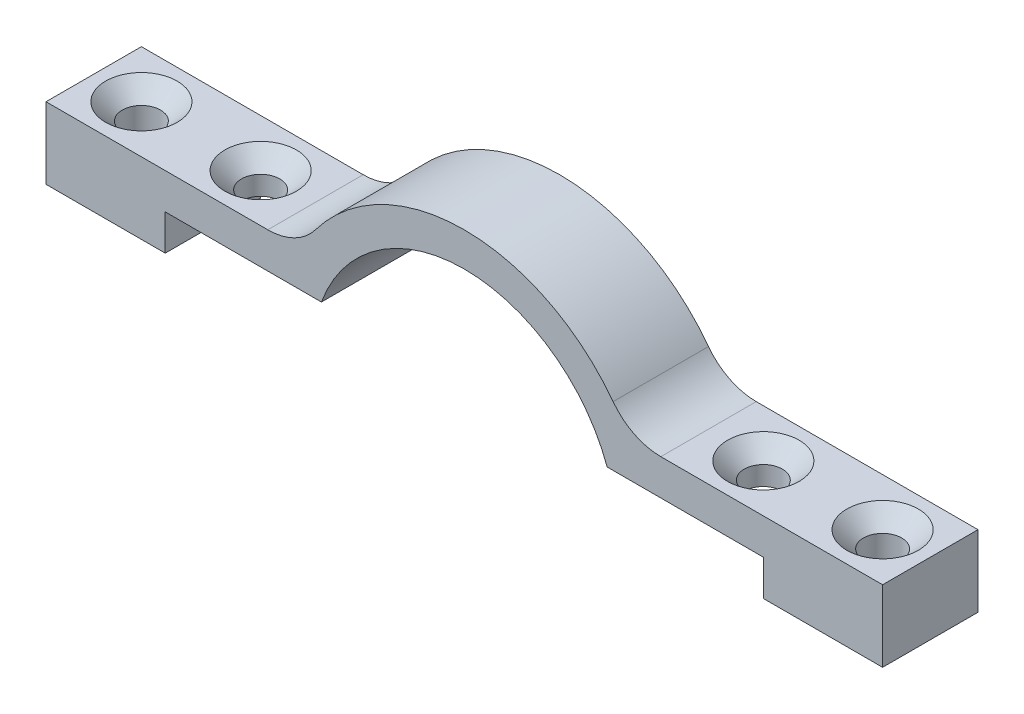
ISO-10303-21;
HEADER;
FILE_DESCRIPTION(('STEP AP214'),'2;1');
FILE_NAME('part.step','',(''),(''),'','','');
FILE_SCHEMA(('AUTOMOTIVE_DESIGN { 1 0 10303 214 1 1 1 1 }'));
ENDSEC;
DATA;
#1=APPLICATION_CONTEXT('core data for automotive mechanical design processes');
#2=APPLICATION_PROTOCOL_DEFINITION('international standard','automotive_design',2000,#1);
#3=PRODUCT_CONTEXT('',#1,'mechanical');
#4=PRODUCT('Part','Part','',(#3));
#5=PRODUCT_RELATED_PRODUCT_CATEGORY('part','',(#4));
#6=PRODUCT_DEFINITION_FORMATION('','',#4);
#7=PRODUCT_DEFINITION_CONTEXT('part definition',#1,'design');
#8=PRODUCT_DEFINITION('design','',#6,#7);
#9=PRODUCT_DEFINITION_SHAPE('','',#8);
#10=(LENGTH_UNIT() NAMED_UNIT(*) SI_UNIT(.MILLI.,.METRE.));
#11=(NAMED_UNIT(*) PLANE_ANGLE_UNIT() SI_UNIT($,.RADIAN.));
#12=(NAMED_UNIT(*) SI_UNIT($,.STERADIAN.) SOLID_ANGLE_UNIT());
#13=UNCERTAINTY_MEASURE_WITH_UNIT(LENGTH_MEASURE(1.E-05),#10,'distance_accuracy_value','');
#14=(GEOMETRIC_REPRESENTATION_CONTEXT(3) GLOBAL_UNCERTAINTY_ASSIGNED_CONTEXT((#13)) GLOBAL_UNIT_ASSIGNED_CONTEXT((#10,
#11,#12)) REPRESENTATION_CONTEXT('',''));
#15=CARTESIAN_POINT('',(0.,0.,0.));
#16=DIRECTION('',(0.,0.,1.));
#17=DIRECTION('',(1.,0.,0.));
#18=AXIS2_PLACEMENT_3D('',#15,#16,#17);
#19=CARTESIAN_POINT('',(0.,4.3607568274022,8.));
#20=DIRECTION('',(0.,1.,0.));
#21=DIRECTION('',(0.,0.,1.));
#22=AXIS2_PLACEMENT_3D('',#19,#20,#21);
#23=PLANE('',#22);
#24=CARTESIAN_POINT('',(21.0781106916815,4.3607568274022,4.));
#25=DIRECTION('',(0.,1.,0.));
#26=DIRECTION('',(0.,0.,1.));
#27=AXIS2_PLACEMENT_3D('',#24,#25,#26);
#28=CIRCLE('',#27,1.60000000000001);
#29=CARTESIAN_POINT('',(21.0781106916815,4.3607568274022,5.60000000000001));
#30=VERTEX_POINT('',#29);
#31=EDGE_CURVE('E275',#30,#30,#28,.T.);
#32=ORIENTED_EDGE('',*,*,#31,.T.);
#33=EDGE_LOOP('',(#32));
#34=FACE_BOUND('',#33,.T.);
#35=DIRECTION('',(1.,0.,0.));
#36=VECTOR('',#35,1.);
#37=CARTESIAN_POINT('',(0.,4.3607568274022,0.));
#38=LINE('',#37,#36);
#39=CARTESIAN_POINT('',(11.9810809150204,4.3607568274022,0.));
#40=VERTEX_POINT('',#39);
#41=CARTESIAN_POINT('',(25.0781106916815,4.3607568274022,0.));
#42=VERTEX_POINT('',#41);
#43=EDGE_CURVE('E157',#40,#42,#38,.T.);
#44=ORIENTED_EDGE('',*,*,#43,.T.);
#45=DIRECTION('',(0.,0.,-1.));
#46=VECTOR('',#45,1.);
#47=CARTESIAN_POINT('',(25.0781106916815,4.3607568274022,8.));
#48=LINE('',#47,#46);
#49=CARTESIAN_POINT('',(25.0781106916815,4.3607568274022,8.));
#50=VERTEX_POINT('',#49);
#51=EDGE_CURVE('E155',#50,#42,#48,.T.);
#52=ORIENTED_EDGE('',*,*,#51,.F.);
#53=DIRECTION('',(1.,0.,0.));
#54=VECTOR('',#53,1.);
#55=CARTESIAN_POINT('',(0.,4.3607568274022,8.));
#56=LINE('',#55,#54);
#57=CARTESIAN_POINT('',(11.9810809150204,4.3607568274022,8.));
#58=VERTEX_POINT('',#57);
#59=EDGE_CURVE('E143',#58,#50,#56,.T.);
#60=ORIENTED_EDGE('',*,*,#59,.F.);
#61=DIRECTION('',(0.,0.,-1.));
#62=VECTOR('',#61,1.);
#63=CARTESIAN_POINT('',(11.9810809150204,4.3607568274022,8.));
#64=LINE('',#63,#62);
#65=EDGE_CURVE('E204',#58,#40,#64,.T.);
#66=ORIENTED_EDGE('',*,*,#65,.T.);
#67=EDGE_LOOP('',(#44,#52,#60,#66));
#68=FACE_BOUND('',#67,.T.);
#69=ADVANCED_FACE('F41',(#34,#68),#23,.F.);
#70=CARTESIAN_POINT('',(25.0781106916815,0.,8.));
#71=DIRECTION('',(-1.,0.,0.));
#72=DIRECTION('',(0.,-1.,0.));
#73=AXIS2_PLACEMENT_3D('',#70,#71,#72);
#74=PLANE('',#73);
#75=DIRECTION('',(0.,1.,0.));
#76=VECTOR('',#75,1.);
#77=CARTESIAN_POINT('',(25.0781106916815,0.,0.));
#78=LINE('',#77,#76);
#79=CARTESIAN_POINT('',(25.0781106916815,1.3607568274022,0.));
#80=VERTEX_POINT('',#79);
#81=EDGE_CURVE('E207',#80,#42,#78,.T.);
#82=ORIENTED_EDGE('',*,*,#81,.F.);
#83=DIRECTION('',(0.,0.,-1.));
#84=VECTOR('',#83,1.);
#85=CARTESIAN_POINT('',(25.0781106916815,1.3607568274022,8.));
#86=LINE('',#85,#84);
#87=CARTESIAN_POINT('',(25.0781106916815,1.3607568274022,8.));
#88=VERTEX_POINT('',#87);
#89=EDGE_CURVE('E163',#88,#80,#86,.T.);
#90=ORIENTED_EDGE('',*,*,#89,.F.);
#91=DIRECTION('',(0.,1.,0.));
#92=VECTOR('',#91,1.);
#93=CARTESIAN_POINT('',(25.0781106916815,0.,8.));
#94=LINE('',#93,#92);
#95=EDGE_CURVE('E147',#88,#50,#94,.T.);
#96=ORIENTED_EDGE('',*,*,#95,.T.);
#97=ORIENTED_EDGE('',*,*,#51,.T.);
#98=EDGE_LOOP('',(#82,#90,#96,#97));
#99=FACE_BOUND('',#98,.T.);
#100=ADVANCED_FACE('F165',(#99),#74,.T.);
#101=CARTESIAN_POINT('',(0.,1.3607568274022,8.));
#102=DIRECTION('',(0.,1.,0.));
#103=DIRECTION('',(-1.,0.,0.));
#104=AXIS2_PLACEMENT_3D('',#101,#102,#103);
#105=PLANE('',#104);
#106=CARTESIAN_POINT('',(31.0781106916815,1.3607568274022,4.));
#107=DIRECTION('',(0.,1.,0.));
#108=DIRECTION('',(0.,0.,1.));
#109=AXIS2_PLACEMENT_3D('',#106,#107,#108);
#110=CIRCLE('',#109,1.6);
#111=CARTESIAN_POINT('',(31.0781106916815,1.3607568274022,5.6));
#112=VERTEX_POINT('',#111);
#113=EDGE_CURVE('E208',#112,#112,#110,.T.);
#114=ORIENTED_EDGE('',*,*,#113,.T.);
#115=EDGE_LOOP('',(#114));
#116=FACE_BOUND('',#115,.T.);
#117=DIRECTION('',(1.,0.,0.));
#118=VECTOR('',#117,1.);
#119=CARTESIAN_POINT('',(0.,1.3607568274022,0.));
#120=LINE('',#119,#118);
#121=CARTESIAN_POINT('',(35.0781106916815,1.3607568274022,0.));
#122=VERTEX_POINT('',#121);
#123=EDGE_CURVE('E211',#80,#122,#120,.T.);
#124=ORIENTED_EDGE('',*,*,#123,.T.);
#125=DIRECTION('',(0.,0.,-1.));
#126=VECTOR('',#125,1.);
#127=CARTESIAN_POINT('',(35.0781106916815,1.3607568274022,8.));
#128=LINE('',#127,#126);
#129=CARTESIAN_POINT('',(35.0781106916815,1.3607568274022,8.));
#130=VERTEX_POINT('',#129);
#131=EDGE_CURVE('E269',#130,#122,#128,.T.);
#132=ORIENTED_EDGE('',*,*,#131,.F.);
#133=DIRECTION('',(1.,0.,0.));
#134=VECTOR('',#133,1.);
#135=CARTESIAN_POINT('',(0.,1.3607568274022,8.));
#136=LINE('',#135,#134);
#137=EDGE_CURVE('E168',#88,#130,#136,.T.);
#138=ORIENTED_EDGE('',*,*,#137,.F.);
#139=ORIENTED_EDGE('',*,*,#89,.T.);
#140=EDGE_LOOP('',(#124,#132,#138,#139));
#141=FACE_BOUND('',#140,.T.);
#142=ADVANCED_FACE('F340',(#116,#141),#105,.F.);
#143=CARTESIAN_POINT('',(35.0781106916815,0.,8.));
#144=DIRECTION('',(-1.,0.,0.));
#145=DIRECTION('',(0.,0.,1.));
#146=AXIS2_PLACEMENT_3D('',#143,#144,#145);
#147=PLANE('',#146);
#148=DIRECTION('',(0.,1.,0.));
#149=VECTOR('',#148,1.);
#150=CARTESIAN_POINT('',(35.0781106916815,0.,0.));
#151=LINE('',#150,#149);
#152=CARTESIAN_POINT('',(35.0781106916815,7.36075682740221,0.));
#153=VERTEX_POINT('',#152);
#154=EDGE_CURVE('E214',#122,#153,#151,.T.);
#155=ORIENTED_EDGE('',*,*,#154,.T.);
#156=DIRECTION('',(0.,0.,-1.));
#157=VECTOR('',#156,1.);
#158=CARTESIAN_POINT('',(35.0781106916815,7.36075682740221,8.));
#159=LINE('',#158,#157);
#160=CARTESIAN_POINT('',(35.0781106916815,7.36075682740221,8.));
#161=VERTEX_POINT('',#160);
#162=EDGE_CURVE('E265',#161,#153,#159,.T.);
#163=ORIENTED_EDGE('',*,*,#162,.F.);
#164=DIRECTION('',(0.,1.,0.));
#165=VECTOR('',#164,1.);
#166=CARTESIAN_POINT('',(35.0781106916815,0.,8.));
#167=LINE('',#166,#165);
#168=EDGE_CURVE('E171',#130,#161,#167,.T.);
#169=ORIENTED_EDGE('',*,*,#168,.F.);
#170=ORIENTED_EDGE('',*,*,#131,.T.);
#171=EDGE_LOOP('',(#155,#163,#169,#170));
#172=FACE_BOUND('',#171,.T.);
#173=ADVANCED_FACE('F343',(#172),#147,.F.);
#174=CARTESIAN_POINT('',(0.,7.3607568274022,8.));
#175=DIRECTION('',(0.,-1.,0.));
#176=DIRECTION('',(1.,0.,0.));
#177=AXIS2_PLACEMENT_3D('',#174,#175,#176);
#178=PLANE('',#177);
#179=CARTESIAN_POINT('',(21.0781106916815,7.3607568274022,4.));
#180=DIRECTION('',(0.,1.,0.));
#181=DIRECTION('',(0.,0.,1.));
#182=AXIS2_PLACEMENT_3D('',#179,#180,#181);
#183=CIRCLE('',#182,3.);
#184=CARTESIAN_POINT('',(21.0781106916815,7.3607568274022,7.));
#185=VERTEX_POINT('',#184);
#186=EDGE_CURVE('E285',#185,#185,#183,.T.);
#187=ORIENTED_EDGE('',*,*,#186,.F.);
#188=EDGE_LOOP('',(#187));
#189=FACE_BOUND('',#188,.T.);
#190=CARTESIAN_POINT('',(31.0781106916815,7.3607568274022,4.));
#191=DIRECTION('',(0.,1.,0.));
#192=DIRECTION('',(0.,0.,1.));
#193=AXIS2_PLACEMENT_3D('',#190,#191,#192);
#194=CIRCLE('',#193,3.);
#195=CARTESIAN_POINT('',(31.0781106916815,7.3607568274022,7.));
#196=VERTEX_POINT('',#195);
#197=EDGE_CURVE('E452',#196,#196,#194,.T.);
#198=ORIENTED_EDGE('',*,*,#197,.F.);
#199=EDGE_LOOP('',(#198));
#200=FACE_BOUND('',#199,.T.);
#201=DIRECTION('',(-1.,0.,0.));
#202=VECTOR('',#201,1.);
#203=CARTESIAN_POINT('',(0.,7.3607568274022,0.));
#204=LINE('',#203,#202);
#205=CARTESIAN_POINT('',(16.4794323522939,7.3607568274022,0.));
#206=VERTEX_POINT('',#205);
#207=EDGE_CURVE('E217',#153,#206,#204,.T.);
#208=ORIENTED_EDGE('',*,*,#207,.T.);
#209=DIRECTION('',(0.,0.,1.));
#210=VECTOR('',#209,1.);
#211=CARTESIAN_POINT('',(16.4794323522939,7.3607568274022,8.));
#212=LINE('',#211,#210);
#213=CARTESIAN_POINT('',(16.4794323522939,7.3607568274022,8.));
#214=VERTEX_POINT('',#213);
#215=EDGE_CURVE('E293',#206,#214,#212,.T.);
#216=ORIENTED_EDGE('',*,*,#215,.T.);
#217=DIRECTION('',(-1.,0.,0.));
#218=VECTOR('',#217,1.);
#219=CARTESIAN_POINT('',(0.,7.3607568274022,8.));
#220=LINE('',#219,#218);
#221=EDGE_CURVE('E177',#161,#214,#220,.T.);
#222=ORIENTED_EDGE('',*,*,#221,.F.);
#223=ORIENTED_EDGE('',*,*,#162,.T.);
#224=EDGE_LOOP('',(#208,#216,#222,#223));
#225=FACE_BOUND('',#224,.T.);
#226=ADVANCED_FACE('F351',(#189,#200,#225),#178,.F.);
#227=CARTESIAN_POINT('',(0.,0.,8.));
#228=DIRECTION('',(0.,0.,-1.));
#229=DIRECTION('',(-1.,0.,0.));
#230=AXIS2_PLACEMENT_3D('',#227,#228,#229);
#231=CYLINDRICAL_SURFACE('',#230,15.6);
#232=CARTESIAN_POINT('',(0.,0.,8.));
#233=DIRECTION('',(0.,0.,1.));
#234=DIRECTION('',(1.,0.,0.));
#235=AXIS2_PLACEMENT_3D('',#232,#233,#234);
#236=CIRCLE('',#235,15.6);
#237=CARTESIAN_POINT('',(12.4795701308633,9.3605731314308,8.));
#238=VERTEX_POINT('',#237);
#239=CARTESIAN_POINT('',(-12.4795701308633,9.36057313143079,8.));
#240=VERTEX_POINT('',#239);
#241=EDGE_CURVE('E181',#238,#240,#236,.T.);
#242=ORIENTED_EDGE('',*,*,#241,.F.);
#243=DIRECTION('',(0.,0.,-1.));
#244=VECTOR('',#243,1.);
#245=CARTESIAN_POINT('',(12.4795701308633,9.3605731314308,8.));
#246=LINE('',#245,#244);
#247=CARTESIAN_POINT('',(12.4795701308633,9.3605731314308,0.));
#248=VERTEX_POINT('',#247);
#249=EDGE_CURVE('E289',#238,#248,#246,.T.);
#250=ORIENTED_EDGE('',*,*,#249,.T.);
#251=CARTESIAN_POINT('',(0.,0.,0.));
#252=DIRECTION('',(0.,0.,1.));
#253=DIRECTION('',(1.,0.,0.));
#254=AXIS2_PLACEMENT_3D('',#251,#252,#253);
#255=CIRCLE('',#254,15.6);
#256=CARTESIAN_POINT('',(-12.4795701308633,9.36057313143079,0.));
#257=VERTEX_POINT('',#256);
#258=EDGE_CURVE('E221',#248,#257,#255,.T.);
#259=ORIENTED_EDGE('',*,*,#258,.T.);
#260=DIRECTION('',(0.,0.,-1.));
#261=VECTOR('',#260,1.);
#262=CARTESIAN_POINT('',(-12.4795701308633,9.36057313143079,8.));
#263=LINE('',#262,#261);
#264=EDGE_CURVE('E162',#257,#240,#263,.F.);
#265=ORIENTED_EDGE('',*,*,#264,.T.);
#266=EDGE_LOOP('',(#242,#250,#259,#265));
#267=FACE_BOUND('',#266,.T.);
#268=ADVANCED_FACE('F311',(#267),#231,.T.);
#269=CARTESIAN_POINT('',(0.,7.3607568274022,8.));
#270=DIRECTION('',(0.,1.,0.));
#271=DIRECTION('',(-1.,0.,0.));
#272=AXIS2_PLACEMENT_3D('',#269,#270,#271);
#273=PLANE('',#272);
#274=CARTESIAN_POINT('',(-21.0781106916815,7.3607568274022,4.));
#275=DIRECTION('',(0.,1.,0.));
#276=DIRECTION('',(0.,0.,1.));
#277=AXIS2_PLACEMENT_3D('',#274,#275,#276);
#278=CIRCLE('',#277,3.);
#279=CARTESIAN_POINT('',(-21.0781106916815,7.3607568274022,7.));
#280=VERTEX_POINT('',#279);
#281=EDGE_CURVE('E435',#280,#280,#278,.T.);
#282=ORIENTED_EDGE('',*,*,#281,.F.);
#283=EDGE_LOOP('',(#282));
#284=FACE_BOUND('',#283,.T.);
#285=CARTESIAN_POINT('',(-31.0781106916815,7.3607568274022,4.));
#286=DIRECTION('',(0.,1.,0.));
#287=DIRECTION('',(0.,0.,1.));
#288=AXIS2_PLACEMENT_3D('',#285,#286,#287);
#289=CIRCLE('',#288,3.);
#290=CARTESIAN_POINT('',(-31.0781106916815,7.3607568274022,7.));
#291=VERTEX_POINT('',#290);
#292=EDGE_CURVE('E279',#291,#291,#289,.T.);
#293=ORIENTED_EDGE('',*,*,#292,.F.);
#294=EDGE_LOOP('',(#293));
#295=FACE_BOUND('',#294,.T.);
#296=DIRECTION('',(1.,0.,0.));
#297=VECTOR('',#296,1.);
#298=CARTESIAN_POINT('',(0.,7.3607568274022,8.));
#299=LINE('',#298,#297);
#300=CARTESIAN_POINT('',(-35.0781106916815,7.3607568274022,8.));
#301=VERTEX_POINT('',#300);
#302=CARTESIAN_POINT('',(-16.4794323522939,7.3607568274022,8.));
#303=VERTEX_POINT('',#302);
#304=EDGE_CURVE('E184',#301,#303,#299,.T.);
#305=ORIENTED_EDGE('',*,*,#304,.T.);
#306=DIRECTION('',(0.,0.,-1.));
#307=VECTOR('',#306,1.);
#308=CARTESIAN_POINT('',(-16.4794323522939,7.3607568274022,8.));
#309=LINE('',#308,#307);
#310=CARTESIAN_POINT('',(-16.4794323522939,7.3607568274022,0.));
#311=VERTEX_POINT('',#310);
#312=EDGE_CURVE('E296',#303,#311,#309,.T.);
#313=ORIENTED_EDGE('',*,*,#312,.T.);
#314=DIRECTION('',(1.,0.,0.));
#315=VECTOR('',#314,1.);
#316=CARTESIAN_POINT('',(0.,7.3607568274022,0.));
#317=LINE('',#316,#315);
#318=CARTESIAN_POINT('',(-35.0781106916815,7.3607568274022,0.));
#319=VERTEX_POINT('',#318);
#320=EDGE_CURVE('E225',#319,#311,#317,.T.);
#321=ORIENTED_EDGE('',*,*,#320,.F.);
#322=DIRECTION('',(0.,0.,-1.));
#323=VECTOR('',#322,1.);
#324=CARTESIAN_POINT('',(-35.0781106916815,7.3607568274022,8.));
#325=LINE('',#324,#323);
#326=EDGE_CURVE('E262',#301,#319,#325,.T.);
#327=ORIENTED_EDGE('',*,*,#326,.F.);
#328=EDGE_LOOP('',(#305,#313,#321,#327));
#329=FACE_BOUND('',#328,.T.);
#330=ADVANCED_FACE('F314',(#284,#295,#329),#273,.T.);
#331=CARTESIAN_POINT('',(-35.0781106916815,0.,8.));
#332=DIRECTION('',(-1.,0.,0.));
#333=DIRECTION('',(0.,0.,1.));
#334=AXIS2_PLACEMENT_3D('',#331,#332,#333);
#335=PLANE('',#334);
#336=DIRECTION('',(0.,1.,0.));
#337=VECTOR('',#336,1.);
#338=CARTESIAN_POINT('',(-35.0781106916815,0.,0.));
#339=LINE('',#338,#337);
#340=CARTESIAN_POINT('',(-35.0781106916815,1.3607568274022,0.));
#341=VERTEX_POINT('',#340);
#342=EDGE_CURVE('E229',#341,#319,#339,.T.);
#343=ORIENTED_EDGE('',*,*,#342,.F.);
#344=DIRECTION('',(0.,0.,-1.));
#345=VECTOR('',#344,1.);
#346=CARTESIAN_POINT('',(-35.0781106916815,1.3607568274022,8.));
#347=LINE('',#346,#345);
#348=CARTESIAN_POINT('',(-35.0781106916815,1.3607568274022,8.));
#349=VERTEX_POINT('',#348);
#350=EDGE_CURVE('E259',#349,#341,#347,.T.);
#351=ORIENTED_EDGE('',*,*,#350,.F.);
#352=DIRECTION('',(0.,1.,0.));
#353=VECTOR('',#352,1.);
#354=CARTESIAN_POINT('',(-35.0781106916815,0.,8.));
#355=LINE('',#354,#353);
#356=EDGE_CURVE('E187',#349,#301,#355,.T.);
#357=ORIENTED_EDGE('',*,*,#356,.T.);
#358=ORIENTED_EDGE('',*,*,#326,.T.);
#359=EDGE_LOOP('',(#343,#351,#357,#358));
#360=FACE_BOUND('',#359,.T.);
#361=ADVANCED_FACE('F319',(#360),#335,.T.);
#362=CARTESIAN_POINT('',(0.,1.3607568274022,8.));
#363=DIRECTION('',(0.,-1.,0.));
#364=DIRECTION('',(1.,0.,0.));
#365=AXIS2_PLACEMENT_3D('',#362,#363,#364);
#366=PLANE('',#365);
#367=CARTESIAN_POINT('',(-31.0781106916815,1.3607568274022,4.));
#368=DIRECTION('',(0.,1.,0.));
#369=DIRECTION('',(0.,0.,1.));
#370=AXIS2_PLACEMENT_3D('',#367,#368,#369);
#371=CIRCLE('',#370,1.6);
#372=CARTESIAN_POINT('',(-31.0781106916815,1.3607568274022,5.6));
#373=VERTEX_POINT('',#372);
#374=EDGE_CURVE('E444',#373,#373,#371,.T.);
#375=ORIENTED_EDGE('',*,*,#374,.T.);
#376=EDGE_LOOP('',(#375));
#377=FACE_BOUND('',#376,.T.);
#378=DIRECTION('',(-1.,0.,0.));
#379=VECTOR('',#378,1.);
#380=CARTESIAN_POINT('',(0.,1.3607568274022,0.));
#381=LINE('',#380,#379);
#382=CARTESIAN_POINT('',(-25.0781106916815,1.3607568274022,0.));
#383=VERTEX_POINT('',#382);
#384=EDGE_CURVE('E233',#383,#341,#381,.T.);
#385=ORIENTED_EDGE('',*,*,#384,.F.);
#386=DIRECTION('',(0.,0.,-1.));
#387=VECTOR('',#386,1.);
#388=CARTESIAN_POINT('',(-25.0781106916815,1.3607568274022,8.));
#389=LINE('',#388,#387);
#390=CARTESIAN_POINT('',(-25.0781106916815,1.3607568274022,8.));
#391=VERTEX_POINT('',#390);
#392=EDGE_CURVE('E256',#391,#383,#389,.T.);
#393=ORIENTED_EDGE('',*,*,#392,.F.);
#394=DIRECTION('',(-1.,0.,0.));
#395=VECTOR('',#394,1.);
#396=CARTESIAN_POINT('',(0.,1.3607568274022,8.));
#397=LINE('',#396,#395);
#398=EDGE_CURVE('E191',#391,#349,#397,.T.);
#399=ORIENTED_EDGE('',*,*,#398,.T.);
#400=ORIENTED_EDGE('',*,*,#350,.T.);
#401=EDGE_LOOP('',(#385,#393,#399,#400));
#402=FACE_BOUND('',#401,.T.);
#403=ADVANCED_FACE('F322',(#377,#402),#366,.T.);
#404=CARTESIAN_POINT('',(-25.0781106916815,0.,8.));
#405=DIRECTION('',(1.,0.,0.));
#406=DIRECTION('',(0.,0.,-1.));
#407=AXIS2_PLACEMENT_3D('',#404,#405,#406);
#408=PLANE('',#407);
#409=DIRECTION('',(0.,-1.,0.));
#410=VECTOR('',#409,1.);
#411=CARTESIAN_POINT('',(-25.0781106916815,0.,0.));
#412=LINE('',#411,#410);
#413=CARTESIAN_POINT('',(-25.0781106916815,4.3607568274022,0.));
#414=VERTEX_POINT('',#413);
#415=EDGE_CURVE('E237',#414,#383,#412,.T.);
#416=ORIENTED_EDGE('',*,*,#415,.F.);
#417=DIRECTION('',(0.,0.,-1.));
#418=VECTOR('',#417,1.);
#419=CARTESIAN_POINT('',(-25.0781106916815,4.3607568274022,8.));
#420=LINE('',#419,#418);
#421=CARTESIAN_POINT('',(-25.0781106916815,4.3607568274022,8.));
#422=VERTEX_POINT('',#421);
#423=EDGE_CURVE('E253',#422,#414,#420,.T.);
#424=ORIENTED_EDGE('',*,*,#423,.F.);
#425=DIRECTION('',(0.,-1.,0.));
#426=VECTOR('',#425,1.);
#427=CARTESIAN_POINT('',(-25.0781106916815,0.,8.));
#428=LINE('',#427,#426);
#429=EDGE_CURVE('E195',#422,#391,#428,.T.);
#430=ORIENTED_EDGE('',*,*,#429,.T.);
#431=ORIENTED_EDGE('',*,*,#392,.T.);
#432=EDGE_LOOP('',(#416,#424,#430,#431));
#433=FACE_BOUND('',#432,.T.);
#434=ADVANCED_FACE('F326',(#433),#408,.T.);
#435=CARTESIAN_POINT('',(0.,4.3607568274022,8.));
#436=DIRECTION('',(0.,1.,0.));
#437=DIRECTION('',(0.,0.,1.));
#438=AXIS2_PLACEMENT_3D('',#435,#436,#437);
#439=PLANE('',#438);
#440=CARTESIAN_POINT('',(-21.0781106916815,4.3607568274022,4.));
#441=DIRECTION('',(0.,1.,0.));
#442=DIRECTION('',(0.,0.,1.));
#443=AXIS2_PLACEMENT_3D('',#440,#441,#442);
#444=CIRCLE('',#443,1.60000000000001);
#445=CARTESIAN_POINT('',(-21.0781106916815,4.3607568274022,5.60000000000001));
#446=VERTEX_POINT('',#445);
#447=EDGE_CURVE('E281',#446,#446,#444,.T.);
#448=ORIENTED_EDGE('',*,*,#447,.T.);
#449=EDGE_LOOP('',(#448));
#450=FACE_BOUND('',#449,.T.);
#451=DIRECTION('',(1.,0.,0.));
#452=VECTOR('',#451,1.);
#453=CARTESIAN_POINT('',(0.,4.3607568274022,0.));
#454=LINE('',#453,#452);
#455=CARTESIAN_POINT('',(-11.9810809150204,4.3607568274022,0.));
#456=VERTEX_POINT('',#455);
#457=EDGE_CURVE('E241',#414,#456,#454,.T.);
#458=ORIENTED_EDGE('',*,*,#457,.T.);
#459=DIRECTION('',(0.,0.,-1.));
#460=VECTOR('',#459,1.);
#461=CARTESIAN_POINT('',(-11.9810809150204,4.3607568274022,8.));
#462=LINE('',#461,#460);
#463=CARTESIAN_POINT('',(-11.9810809150204,4.3607568274022,8.));
#464=VERTEX_POINT('',#463);
#465=EDGE_CURVE('E250',#464,#456,#462,.T.);
#466=ORIENTED_EDGE('',*,*,#465,.F.);
#467=DIRECTION('',(1.,0.,0.));
#468=VECTOR('',#467,1.);
#469=CARTESIAN_POINT('',(0.,4.3607568274022,8.));
#470=LINE('',#469,#468);
#471=EDGE_CURVE('E199',#422,#464,#470,.T.);
#472=ORIENTED_EDGE('',*,*,#471,.F.);
#473=ORIENTED_EDGE('',*,*,#423,.T.);
#474=EDGE_LOOP('',(#458,#466,#472,#473));
#475=FACE_BOUND('',#474,.T.);
#476=ADVANCED_FACE('F331',(#450,#475),#439,.F.);
#477=CARTESIAN_POINT('',(0.,0.,8.));
#478=DIRECTION('',(0.,0.,-1.));
#479=DIRECTION('',(-1.,0.,0.));
#480=AXIS2_PLACEMENT_3D('',#477,#478,#479);
#481=CYLINDRICAL_SURFACE('',#480,12.75);
#482=CARTESIAN_POINT('',(0.,0.,0.));
#483=DIRECTION('',(0.,0.,1.));
#484=DIRECTION('',(1.,0.,0.));
#485=AXIS2_PLACEMENT_3D('',#482,#483,#484);
#486=CIRCLE('',#485,12.75);
#487=EDGE_CURVE('E152',#40,#456,#486,.T.);
#488=ORIENTED_EDGE('',*,*,#487,.F.);
#489=ORIENTED_EDGE('',*,*,#65,.F.);
#490=CARTESIAN_POINT('',(0.,0.,8.));
#491=DIRECTION('',(0.,0.,1.));
#492=DIRECTION('',(1.,0.,0.));
#493=AXIS2_PLACEMENT_3D('',#490,#491,#492);
#494=CIRCLE('',#493,12.75);
#495=EDGE_CURVE('E149',#58,#464,#494,.T.);
#496=ORIENTED_EDGE('',*,*,#495,.T.);
#497=ORIENTED_EDGE('',*,*,#465,.T.);
#498=EDGE_LOOP('',(#488,#489,#496,#497));
#499=FACE_BOUND('',#498,.T.);
#500=ADVANCED_FACE('F334',(#499),#481,.F.);
#501=CARTESIAN_POINT('',(0.,0.,8.));
#502=DIRECTION('',(0.,0.,1.));
#503=DIRECTION('',(1.,0.,0.));
#504=AXIS2_PLACEMENT_3D('',#501,#502,#503);
#505=PLANE('',#504);
#506=ORIENTED_EDGE('',*,*,#59,.T.);
#507=ORIENTED_EDGE('',*,*,#95,.F.);
#508=ORIENTED_EDGE('',*,*,#137,.T.);
#509=ORIENTED_EDGE('',*,*,#168,.T.);
#510=ORIENTED_EDGE('',*,*,#221,.T.);
#511=CARTESIAN_POINT('',(16.4794323522939,12.3607568274022,8.));
#512=DIRECTION('',(0.,0.,1.));
#513=DIRECTION('',(1.,0.,0.));
#514=AXIS2_PLACEMENT_3D('',#511,#512,#513);
#515=CIRCLE('',#514,5.);
#516=EDGE_CURVE('E302',#214,#238,#515,.F.);
#517=ORIENTED_EDGE('',*,*,#516,.T.);
#518=ORIENTED_EDGE('',*,*,#241,.T.);
#519=CARTESIAN_POINT('',(-16.4794323522939,12.3607568274022,8.));
#520=DIRECTION('',(0.,0.,1.));
#521=DIRECTION('',(1.,0.,0.));
#522=AXIS2_PLACEMENT_3D('',#519,#520,#521);
#523=CIRCLE('',#522,5.);
#524=EDGE_CURVE('E11',#240,#303,#523,.F.);
#525=ORIENTED_EDGE('',*,*,#524,.T.);
#526=ORIENTED_EDGE('',*,*,#304,.F.);
#527=ORIENTED_EDGE('',*,*,#356,.F.);
#528=ORIENTED_EDGE('',*,*,#398,.F.);
#529=ORIENTED_EDGE('',*,*,#429,.F.);
#530=ORIENTED_EDGE('',*,*,#471,.T.);
#531=ORIENTED_EDGE('',*,*,#495,.F.);
#532=EDGE_LOOP('',(#506,#507,#508,#509,#510,#517,#518,#525,#526,#527,#528,#529,#530,#531));
#533=FACE_BOUND('',#532,.T.);
#534=ADVANCED_FACE('F145',(#533),#505,.T.);
#535=CARTESIAN_POINT('',(0.,0.,0.));
#536=DIRECTION('',(0.,0.,1.));
#537=DIRECTION('',(1.,0.,0.));
#538=AXIS2_PLACEMENT_3D('',#535,#536,#537);
#539=PLANE('',#538);
#540=ORIENTED_EDGE('',*,*,#43,.F.);
#541=ORIENTED_EDGE('',*,*,#487,.T.);
#542=ORIENTED_EDGE('',*,*,#457,.F.);
#543=ORIENTED_EDGE('',*,*,#415,.T.);
#544=ORIENTED_EDGE('',*,*,#384,.T.);
#545=ORIENTED_EDGE('',*,*,#342,.T.);
#546=ORIENTED_EDGE('',*,*,#320,.T.);
#547=CARTESIAN_POINT('',(-16.4794323522939,12.3607568274022,0.));
#548=DIRECTION('',(0.,0.,1.));
#549=DIRECTION('',(1.,0.,0.));
#550=AXIS2_PLACEMENT_3D('',#547,#548,#549);
#551=CIRCLE('',#550,5.);
#552=EDGE_CURVE('E50',#311,#257,#551,.T.);
#553=ORIENTED_EDGE('',*,*,#552,.T.);
#554=ORIENTED_EDGE('',*,*,#258,.F.);
#555=CARTESIAN_POINT('',(16.4794323522939,12.3607568274022,0.));
#556=DIRECTION('',(0.,0.,1.));
#557=DIRECTION('',(1.,0.,0.));
#558=AXIS2_PLACEMENT_3D('',#555,#556,#557);
#559=CIRCLE('',#558,5.);
#560=EDGE_CURVE('E299',#248,#206,#559,.T.);
#561=ORIENTED_EDGE('',*,*,#560,.T.);
#562=ORIENTED_EDGE('',*,*,#207,.F.);
#563=ORIENTED_EDGE('',*,*,#154,.F.);
#564=ORIENTED_EDGE('',*,*,#123,.F.);
#565=ORIENTED_EDGE('',*,*,#81,.T.);
#566=EDGE_LOOP('',(#540,#541,#542,#543,#544,#545,#546,#553,#554,#561,#562,#563,#564,#565));
#567=FACE_BOUND('',#566,.T.);
#568=ADVANCED_FACE('F307',(#567),#539,.F.);
#569=CARTESIAN_POINT('',(31.0781106916815,7.3607568274022,4.));
#570=DIRECTION('',(0.,1.,0.));
#571=DIRECTION('',(0.,0.,1.));
#572=AXIS2_PLACEMENT_3D('',#569,#570,#571);
#573=CYLINDRICAL_SURFACE('',#572,1.6);
#574=ORIENTED_EDGE('',*,*,#113,.F.);
#575=EDGE_LOOP('',(#574));
#576=FACE_BOUND('',#575,.T.);
#577=CARTESIAN_POINT('',(31.0781106916815,5.96075682740222,4.));
#578=DIRECTION('',(0.,1.,0.));
#579=DIRECTION('',(0.,0.,1.));
#580=AXIS2_PLACEMENT_3D('',#577,#578,#579);
#581=CIRCLE('',#580,1.60000000000001);
#582=CARTESIAN_POINT('',(31.0781106916815,5.96075682740222,5.60000000000001));
#583=VERTEX_POINT('',#582);
#584=EDGE_CURVE('E456',#583,#583,#581,.T.);
#585=ORIENTED_EDGE('',*,*,#584,.T.);
#586=EDGE_LOOP('',(#585));
#587=FACE_BOUND('',#586,.T.);
#588=ADVANCED_FACE('F407',(#576,#587),#573,.F.);
#589=CARTESIAN_POINT('',(31.0781106916815,7.3607568274022,4.));
#590=DIRECTION('',(0.,1.,0.));
#591=DIRECTION('',(0.,0.,1.));
#592=AXIS2_PLACEMENT_3D('',#589,#590,#591);
#593=CONICAL_SURFACE('',#592,3.,0.785398163397448);
#594=ORIENTED_EDGE('',*,*,#584,.F.);
#595=EDGE_LOOP('',(#594));
#596=FACE_BOUND('',#595,.T.);
#597=ORIENTED_EDGE('',*,*,#197,.T.);
#598=EDGE_LOOP('',(#597));
#599=FACE_BOUND('',#598,.T.);
#600=ADVANCED_FACE('F403',(#596,#599),#593,.F.);
#601=CARTESIAN_POINT('',(-31.0781106916815,7.3607568274022,4.));
#602=DIRECTION('',(0.,1.,0.));
#603=DIRECTION('',(0.,0.,1.));
#604=AXIS2_PLACEMENT_3D('',#601,#602,#603);
#605=CYLINDRICAL_SURFACE('',#604,1.60000000000001);
#606=ORIENTED_EDGE('',*,*,#374,.F.);
#607=EDGE_LOOP('',(#606));
#608=FACE_BOUND('',#607,.T.);
#609=CARTESIAN_POINT('',(-31.0781106916815,5.96075682740222,4.));
#610=DIRECTION('',(0.,1.,0.));
#611=DIRECTION('',(0.,0.,1.));
#612=AXIS2_PLACEMENT_3D('',#609,#610,#611);
#613=CIRCLE('',#612,1.60000000000001);
#614=CARTESIAN_POINT('',(-31.0781106916815,5.96075682740222,5.60000000000001));
#615=VERTEX_POINT('',#614);
#616=EDGE_CURVE('E440',#615,#615,#613,.T.);
#617=ORIENTED_EDGE('',*,*,#616,.T.);
#618=EDGE_LOOP('',(#617));
#619=FACE_BOUND('',#618,.T.);
#620=ADVANCED_FACE('F399',(#608,#619),#605,.F.);
#621=CARTESIAN_POINT('',(-31.0781106916815,7.3607568274022,4.));
#622=DIRECTION('',(0.,1.,0.));
#623=DIRECTION('',(0.,0.,1.));
#624=AXIS2_PLACEMENT_3D('',#621,#622,#623);
#625=CONICAL_SURFACE('',#624,3.,0.785398163397449);
#626=ORIENTED_EDGE('',*,*,#616,.F.);
#627=EDGE_LOOP('',(#626));
#628=FACE_BOUND('',#627,.T.);
#629=ORIENTED_EDGE('',*,*,#292,.T.);
#630=EDGE_LOOP('',(#629));
#631=FACE_BOUND('',#630,.T.);
#632=ADVANCED_FACE('F395',(#628,#631),#625,.F.);
#633=CARTESIAN_POINT('',(21.0781106916815,7.3607568274022,4.));
#634=DIRECTION('',(0.,1.,0.));
#635=DIRECTION('',(0.,0.,1.));
#636=AXIS2_PLACEMENT_3D('',#633,#634,#635);
#637=CYLINDRICAL_SURFACE('',#636,1.60000000000001);
#638=CARTESIAN_POINT('',(21.0781106916815,5.96075682740222,4.));
#639=DIRECTION('',(0.,1.,0.));
#640=DIRECTION('',(0.,0.,1.));
#641=AXIS2_PLACEMENT_3D('',#638,#639,#640);
#642=CIRCLE('',#641,1.60000000000001);
#643=CARTESIAN_POINT('',(21.0781106916815,5.96075682740222,5.60000000000001));
#644=VERTEX_POINT('',#643);
#645=EDGE_CURVE('E280',#644,#644,#642,.T.);
#646=ORIENTED_EDGE('',*,*,#645,.T.);
#647=EDGE_LOOP('',(#646));
#648=FACE_BOUND('',#647,.T.);
#649=ORIENTED_EDGE('',*,*,#31,.F.);
#650=EDGE_LOOP('',(#649));
#651=FACE_BOUND('',#650,.T.);
#652=ADVANCED_FACE('F391',(#648,#651),#637,.F.);
#653=CARTESIAN_POINT('',(21.0781106916815,7.3607568274022,4.));
#654=DIRECTION('',(0.,1.,0.));
#655=DIRECTION('',(0.,0.,1.));
#656=AXIS2_PLACEMENT_3D('',#653,#654,#655);
#657=CONICAL_SURFACE('',#656,3.,0.785398163397449);
#658=ORIENTED_EDGE('',*,*,#645,.F.);
#659=EDGE_LOOP('',(#658));
#660=FACE_BOUND('',#659,.T.);
#661=ORIENTED_EDGE('',*,*,#186,.T.);
#662=EDGE_LOOP('',(#661));
#663=FACE_BOUND('',#662,.T.);
#664=ADVANCED_FACE('F383',(#660,#663),#657,.F.);
#665=CARTESIAN_POINT('',(-21.0781106916815,7.3607568274022,4.));
#666=DIRECTION('',(0.,1.,0.));
#667=DIRECTION('',(0.,0.,1.));
#668=AXIS2_PLACEMENT_3D('',#665,#666,#667);
#669=CYLINDRICAL_SURFACE('',#668,1.60000000000001);
#670=CARTESIAN_POINT('',(-21.0781106916815,5.96075682740222,4.));
#671=DIRECTION('',(0.,1.,0.));
#672=DIRECTION('',(0.,0.,1.));
#673=AXIS2_PLACEMENT_3D('',#670,#671,#672);
#674=CIRCLE('',#673,1.60000000000001);
#675=CARTESIAN_POINT('',(-21.0781106916815,5.96075682740222,5.60000000000001));
#676=VERTEX_POINT('',#675);
#677=EDGE_CURVE('E286',#676,#676,#674,.T.);
#678=ORIENTED_EDGE('',*,*,#677,.T.);
#679=EDGE_LOOP('',(#678));
#680=FACE_BOUND('',#679,.T.);
#681=ORIENTED_EDGE('',*,*,#447,.F.);
#682=EDGE_LOOP('',(#681));
#683=FACE_BOUND('',#682,.T.);
#684=ADVANCED_FACE('F377',(#680,#683),#669,.F.);
#685=CARTESIAN_POINT('',(-21.0781106916815,7.3607568274022,4.));
#686=DIRECTION('',(0.,1.,0.));
#687=DIRECTION('',(0.,0.,1.));
#688=AXIS2_PLACEMENT_3D('',#685,#686,#687);
#689=CONICAL_SURFACE('',#688,3.,0.785398163397449);
#690=ORIENTED_EDGE('',*,*,#677,.F.);
#691=EDGE_LOOP('',(#690));
#692=FACE_BOUND('',#691,.T.);
#693=ORIENTED_EDGE('',*,*,#281,.T.);
#694=EDGE_LOOP('',(#693));
#695=FACE_BOUND('',#694,.T.);
#696=ADVANCED_FACE('F372',(#692,#695),#689,.F.);
#697=CARTESIAN_POINT('',(16.4794323522939,12.3607568274022,8.));
#698=DIRECTION('',(0.,0.,-1.));
#699=DIRECTION('',(-1.,0.,0.));
#700=AXIS2_PLACEMENT_3D('',#697,#698,#699);
#701=CYLINDRICAL_SURFACE('',#700,5.);
#702=ORIENTED_EDGE('',*,*,#516,.F.);
#703=ORIENTED_EDGE('',*,*,#215,.F.);
#704=ORIENTED_EDGE('',*,*,#560,.F.);
#705=ORIENTED_EDGE('',*,*,#249,.F.);
#706=EDGE_LOOP('',(#702,#703,#704,#705));
#707=FACE_BOUND('',#706,.T.);
#708=ADVANCED_FACE('F350',(#707),#701,.F.);
#709=CARTESIAN_POINT('',(-16.4794323522939,12.3607568274022,8.));
#710=DIRECTION('',(0.,0.,-1.));
#711=DIRECTION('',(-1.,0.,0.));
#712=AXIS2_PLACEMENT_3D('',#709,#710,#711);
#713=CYLINDRICAL_SURFACE('',#712,5.);
#714=ORIENTED_EDGE('',*,*,#524,.F.);
#715=ORIENTED_EDGE('',*,*,#264,.F.);
#716=ORIENTED_EDGE('',*,*,#552,.F.);
#717=ORIENTED_EDGE('',*,*,#312,.F.);
#718=EDGE_LOOP('',(#714,#715,#716,#717));
#719=FACE_BOUND('',#718,.T.);
#720=ADVANCED_FACE('F43',(#719),#713,.F.);
#721=CLOSED_SHELL('',(#69,#100,#142,#173,#226,#268,#330,#361,#403,#434,#476,#500,#534,#568,#588,
#600,#620,#632,#652,#664,#684,#696,#708,#720));
#722=MANIFOLD_SOLID_BREP('B2',#721);
#723=ADVANCED_BREP_SHAPE_REPRESENTATION('',(#18,#722),#14);
#724=SHAPE_DEFINITION_REPRESENTATION(#9,#723);
ENDSEC;
END-ISO-10303-21;
